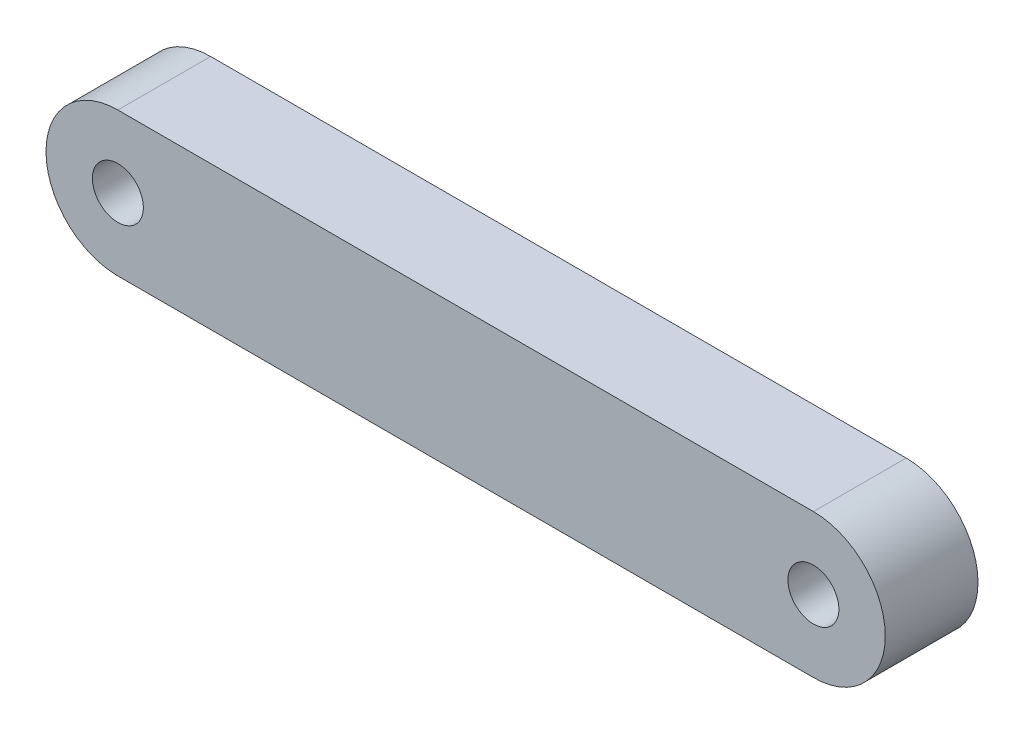
ISO-10303-21;
HEADER;
FILE_DESCRIPTION(('STEP AP214'),'2;1');
FILE_NAME('part.step','',(''),(''),'','','');
FILE_SCHEMA(('AUTOMOTIVE_DESIGN { 1 0 10303 214 1 1 1 1 }'));
ENDSEC;
DATA;
#1=APPLICATION_CONTEXT('core data for automotive mechanical design processes');
#2=APPLICATION_PROTOCOL_DEFINITION('international standard','automotive_design',2000,#1);
#3=PRODUCT_CONTEXT('',#1,'mechanical');
#4=PRODUCT('Part','Part','',(#3));
#5=PRODUCT_RELATED_PRODUCT_CATEGORY('part','',(#4));
#6=PRODUCT_DEFINITION_FORMATION('','',#4);
#7=PRODUCT_DEFINITION_CONTEXT('part definition',#1,'design');
#8=PRODUCT_DEFINITION('design','',#6,#7);
#9=PRODUCT_DEFINITION_SHAPE('','',#8);
#10=(LENGTH_UNIT() NAMED_UNIT(*) SI_UNIT(.MILLI.,.METRE.));
#11=(NAMED_UNIT(*) PLANE_ANGLE_UNIT() SI_UNIT($,.RADIAN.));
#12=(NAMED_UNIT(*) SI_UNIT($,.STERADIAN.) SOLID_ANGLE_UNIT());
#13=UNCERTAINTY_MEASURE_WITH_UNIT(LENGTH_MEASURE(1.E-05),#10,'distance_accuracy_value','');
#14=(GEOMETRIC_REPRESENTATION_CONTEXT(3) GLOBAL_UNCERTAINTY_ASSIGNED_CONTEXT((#13)) GLOBAL_UNIT_ASSIGNED_CONTEXT((#10,
#11,#12)) REPRESENTATION_CONTEXT('',''));
#15=CARTESIAN_POINT('',(0.,0.,0.));
#16=DIRECTION('',(0.,0.,1.));
#17=DIRECTION('',(1.,0.,0.));
#18=AXIS2_PLACEMENT_3D('',#15,#16,#17);
#19=CARTESIAN_POINT('',(0.,0.,4.));
#20=DIRECTION('',(0.,0.,1.));
#21=DIRECTION('',(1.,0.,0.));
#22=AXIS2_PLACEMENT_3D('',#19,#20,#21);
#23=PLANE('',#22);
#24=CARTESIAN_POINT('',(0.,0.,4.));
#25=DIRECTION('',(0.,0.,1.));
#26=DIRECTION('',(1.,0.,0.));
#27=AXIS2_PLACEMENT_3D('',#24,#25,#26);
#28=CIRCLE('',#27,1.1);
#29=CARTESIAN_POINT('',(1.1,0.,4.));
#30=VERTEX_POINT('',#29);
#31=EDGE_CURVE('E116',#30,#30,#28,.T.);
#32=ORIENTED_EDGE('',*,*,#31,.F.);
#33=EDGE_LOOP('',(#32));
#34=FACE_BOUND('',#33,.T.);
#35=CARTESIAN_POINT('',(0.,0.,4.));
#36=DIRECTION('',(0.,0.,1.));
#37=DIRECTION('',(1.,0.,0.));
#38=AXIS2_PLACEMENT_3D('',#35,#36,#37);
#39=CIRCLE('',#38,3.1);
#40=CARTESIAN_POINT('',(0.,3.1,4.));
#41=VERTEX_POINT('',#40);
#42=CARTESIAN_POINT('',(0.,-3.1,4.));
#43=VERTEX_POINT('',#42);
#44=EDGE_CURVE('E96',#41,#43,#39,.T.);
#45=ORIENTED_EDGE('',*,*,#44,.T.);
#46=DIRECTION('',(1.,0.,0.));
#47=VECTOR('',#46,1.);
#48=CARTESIAN_POINT('',(0.,-3.1,4.));
#49=LINE('',#48,#47);
#50=CARTESIAN_POINT('',(30.,-3.1,4.));
#51=VERTEX_POINT('',#50);
#52=EDGE_CURVE('E91',#43,#51,#49,.T.);
#53=ORIENTED_EDGE('',*,*,#52,.T.);
#54=CARTESIAN_POINT('',(30.,0.,4.));
#55=DIRECTION('',(0.,0.,1.));
#56=DIRECTION('',(1.,0.,0.));
#57=AXIS2_PLACEMENT_3D('',#54,#55,#56);
#58=CIRCLE('',#57,3.1);
#59=CARTESIAN_POINT('',(30.,3.1,4.));
#60=VERTEX_POINT('',#59);
#61=EDGE_CURVE('E94',#51,#60,#58,.T.);
#62=ORIENTED_EDGE('',*,*,#61,.T.);
#63=DIRECTION('',(-1.,0.,0.));
#64=VECTOR('',#63,1.);
#65=CARTESIAN_POINT('',(0.,3.1,4.));
#66=LINE('',#65,#64);
#67=EDGE_CURVE('E61',#60,#41,#66,.T.);
#68=ORIENTED_EDGE('',*,*,#67,.T.);
#69=EDGE_LOOP('',(#45,#53,#62,#68));
#70=FACE_BOUND('',#69,.T.);
#71=CARTESIAN_POINT('',(30.,0.,4.));
#72=DIRECTION('',(0.,0.,1.));
#73=DIRECTION('',(1.,0.,0.));
#74=AXIS2_PLACEMENT_3D('',#71,#72,#73);
#75=CIRCLE('',#74,1.1);
#76=CARTESIAN_POINT('',(31.1,0.,4.));
#77=VERTEX_POINT('',#76);
#78=EDGE_CURVE('E138',#77,#77,#75,.T.);
#79=ORIENTED_EDGE('',*,*,#78,.F.);
#80=EDGE_LOOP('',(#79));
#81=FACE_BOUND('',#80,.T.);
#82=ADVANCED_FACE('F43',(#34,#70,#81),#23,.T.);
#83=CARTESIAN_POINT('',(0.,0.,0.));
#84=DIRECTION('',(0.,0.,1.));
#85=DIRECTION('',(1.,0.,0.));
#86=AXIS2_PLACEMENT_3D('',#83,#84,#85);
#87=PLANE('',#86);
#88=CARTESIAN_POINT('',(0.,0.,0.));
#89=DIRECTION('',(0.,0.,1.));
#90=DIRECTION('',(1.,0.,0.));
#91=AXIS2_PLACEMENT_3D('',#88,#89,#90);
#92=CIRCLE('',#91,3.1);
#93=CARTESIAN_POINT('',(0.,3.1,0.));
#94=VERTEX_POINT('',#93);
#95=CARTESIAN_POINT('',(0.,-3.1,0.));
#96=VERTEX_POINT('',#95);
#97=EDGE_CURVE('E112',#94,#96,#92,.T.);
#98=ORIENTED_EDGE('',*,*,#97,.F.);
#99=DIRECTION('',(-1.,0.,0.));
#100=VECTOR('',#99,1.);
#101=CARTESIAN_POINT('',(0.,3.1,0.));
#102=LINE('',#101,#100);
#103=CARTESIAN_POINT('',(30.,3.1,0.));
#104=VERTEX_POINT('',#103);
#105=EDGE_CURVE('E84',#104,#94,#102,.T.);
#106=ORIENTED_EDGE('',*,*,#105,.F.);
#107=CARTESIAN_POINT('',(30.,0.,0.));
#108=DIRECTION('',(0.,0.,1.));
#109=DIRECTION('',(1.,0.,0.));
#110=AXIS2_PLACEMENT_3D('',#107,#108,#109);
#111=CIRCLE('',#110,3.1);
#112=CARTESIAN_POINT('',(30.,-3.1,0.));
#113=VERTEX_POINT('',#112);
#114=EDGE_CURVE('E78',#113,#104,#111,.T.);
#115=ORIENTED_EDGE('',*,*,#114,.F.);
#116=DIRECTION('',(1.,0.,0.));
#117=VECTOR('',#116,1.);
#118=CARTESIAN_POINT('',(0.,-3.1,0.));
#119=LINE('',#118,#117);
#120=EDGE_CURVE('E101',#96,#113,#119,.T.);
#121=ORIENTED_EDGE('',*,*,#120,.F.);
#122=EDGE_LOOP('',(#98,#106,#115,#121));
#123=FACE_BOUND('',#122,.T.);
#124=CARTESIAN_POINT('',(0.,0.,0.));
#125=DIRECTION('',(0.,0.,1.));
#126=DIRECTION('',(1.,0.,0.));
#127=AXIS2_PLACEMENT_3D('',#124,#125,#126);
#128=CIRCLE('',#127,1.1);
#129=CARTESIAN_POINT('',(1.1,0.,0.));
#130=VERTEX_POINT('',#129);
#131=EDGE_CURVE('E134',#130,#130,#128,.T.);
#132=ORIENTED_EDGE('',*,*,#131,.T.);
#133=EDGE_LOOP('',(#132));
#134=FACE_BOUND('',#133,.T.);
#135=CARTESIAN_POINT('',(30.,0.,0.));
#136=DIRECTION('',(0.,0.,1.));
#137=DIRECTION('',(1.,0.,0.));
#138=AXIS2_PLACEMENT_3D('',#135,#136,#137);
#139=CIRCLE('',#138,1.1);
#140=CARTESIAN_POINT('',(31.1,0.,0.));
#141=VERTEX_POINT('',#140);
#142=EDGE_CURVE('E142',#141,#141,#139,.T.);
#143=ORIENTED_EDGE('',*,*,#142,.T.);
#144=EDGE_LOOP('',(#143));
#145=FACE_BOUND('',#144,.T.);
#146=ADVANCED_FACE('F129',(#123,#134,#145),#87,.F.);
#147=CARTESIAN_POINT('',(0.,0.,4.));
#148=DIRECTION('',(0.,0.,-1.));
#149=DIRECTION('',(-1.,0.,0.));
#150=AXIS2_PLACEMENT_3D('',#147,#148,#149);
#151=CYLINDRICAL_SURFACE('',#150,3.1);
#152=ORIENTED_EDGE('',*,*,#97,.T.);
#153=DIRECTION('',(0.,0.,-1.));
#154=VECTOR('',#153,1.);
#155=CARTESIAN_POINT('',(0.,-3.1,4.));
#156=LINE('',#155,#154);
#157=EDGE_CURVE('E11',#43,#96,#156,.T.);
#158=ORIENTED_EDGE('',*,*,#157,.F.);
#159=ORIENTED_EDGE('',*,*,#44,.F.);
#160=DIRECTION('',(0.,0.,-1.));
#161=VECTOR('',#160,1.);
#162=CARTESIAN_POINT('',(0.,3.1,4.));
#163=LINE('',#162,#161);
#164=EDGE_CURVE('E108',#41,#94,#163,.T.);
#165=ORIENTED_EDGE('',*,*,#164,.T.);
#166=EDGE_LOOP('',(#152,#158,#159,#165));
#167=FACE_BOUND('',#166,.T.);
#168=ADVANCED_FACE('F45',(#167),#151,.T.);
#169=CARTESIAN_POINT('',(0.,-3.1,4.));
#170=DIRECTION('',(0.,1.,0.));
#171=DIRECTION('',(-1.,0.,0.));
#172=AXIS2_PLACEMENT_3D('',#169,#170,#171);
#173=PLANE('',#172);
#174=ORIENTED_EDGE('',*,*,#120,.T.);
#175=DIRECTION('',(0.,0.,-1.));
#176=VECTOR('',#175,1.);
#177=CARTESIAN_POINT('',(30.,-3.1,4.));
#178=LINE('',#177,#176);
#179=EDGE_CURVE('E53',#51,#113,#178,.T.);
#180=ORIENTED_EDGE('',*,*,#179,.F.);
#181=ORIENTED_EDGE('',*,*,#52,.F.);
#182=ORIENTED_EDGE('',*,*,#157,.T.);
#183=EDGE_LOOP('',(#174,#180,#181,#182));
#184=FACE_BOUND('',#183,.T.);
#185=ADVANCED_FACE('F100',(#184),#173,.F.);
#186=CARTESIAN_POINT('',(30.,0.,4.));
#187=DIRECTION('',(0.,0.,-1.));
#188=DIRECTION('',(-1.,0.,0.));
#189=AXIS2_PLACEMENT_3D('',#186,#187,#188);
#190=CYLINDRICAL_SURFACE('',#189,3.1);
#191=ORIENTED_EDGE('',*,*,#114,.T.);
#192=DIRECTION('',(0.,0.,-1.));
#193=VECTOR('',#192,1.);
#194=CARTESIAN_POINT('',(30.,3.1,4.));
#195=LINE('',#194,#193);
#196=EDGE_CURVE('E103',#60,#104,#195,.T.);
#197=ORIENTED_EDGE('',*,*,#196,.F.);
#198=ORIENTED_EDGE('',*,*,#61,.F.);
#199=ORIENTED_EDGE('',*,*,#179,.T.);
#200=EDGE_LOOP('',(#191,#197,#198,#199));
#201=FACE_BOUND('',#200,.T.);
#202=ADVANCED_FACE('F104',(#201),#190,.T.);
#203=CARTESIAN_POINT('',(0.,3.1,4.));
#204=DIRECTION('',(0.,-1.,0.));
#205=DIRECTION('',(0.,0.,-1.));
#206=AXIS2_PLACEMENT_3D('',#203,#204,#205);
#207=PLANE('',#206);
#208=ORIENTED_EDGE('',*,*,#105,.T.);
#209=ORIENTED_EDGE('',*,*,#164,.F.);
#210=ORIENTED_EDGE('',*,*,#67,.F.);
#211=ORIENTED_EDGE('',*,*,#196,.T.);
#212=EDGE_LOOP('',(#208,#209,#210,#211));
#213=FACE_BOUND('',#212,.T.);
#214=ADVANCED_FACE('F126',(#213),#207,.F.);
#215=CARTESIAN_POINT('',(0.,0.,4.));
#216=DIRECTION('',(0.,0.,-1.));
#217=DIRECTION('',(-1.,0.,0.));
#218=AXIS2_PLACEMENT_3D('',#215,#216,#217);
#219=CYLINDRICAL_SURFACE('',#218,1.1);
#220=ORIENTED_EDGE('',*,*,#31,.T.);
#221=EDGE_LOOP('',(#220));
#222=FACE_BOUND('',#221,.T.);
#223=ORIENTED_EDGE('',*,*,#131,.F.);
#224=EDGE_LOOP('',(#223));
#225=FACE_BOUND('',#224,.T.);
#226=ADVANCED_FACE('F161',(#222,#225),#219,.F.);
#227=CARTESIAN_POINT('',(30.,0.,4.));
#228=DIRECTION('',(0.,0.,-1.));
#229=DIRECTION('',(-1.,0.,0.));
#230=AXIS2_PLACEMENT_3D('',#227,#228,#229);
#231=CYLINDRICAL_SURFACE('',#230,1.1);
#232=ORIENTED_EDGE('',*,*,#78,.T.);
#233=EDGE_LOOP('',(#232));
#234=FACE_BOUND('',#233,.T.);
#235=ORIENTED_EDGE('',*,*,#142,.F.);
#236=EDGE_LOOP('',(#235));
#237=FACE_BOUND('',#236,.T.);
#238=ADVANCED_FACE('F150',(#234,#237),#231,.F.);
#239=CLOSED_SHELL('',(#82,#146,#168,#185,#202,#214,#226,#238));
#240=MANIFOLD_SOLID_BREP('B2',#239);
#241=ADVANCED_BREP_SHAPE_REPRESENTATION('',(#18,#240),#14);
#242=SHAPE_DEFINITION_REPRESENTATION(#9,#241);
ENDSEC;
END-ISO-10303-21;
